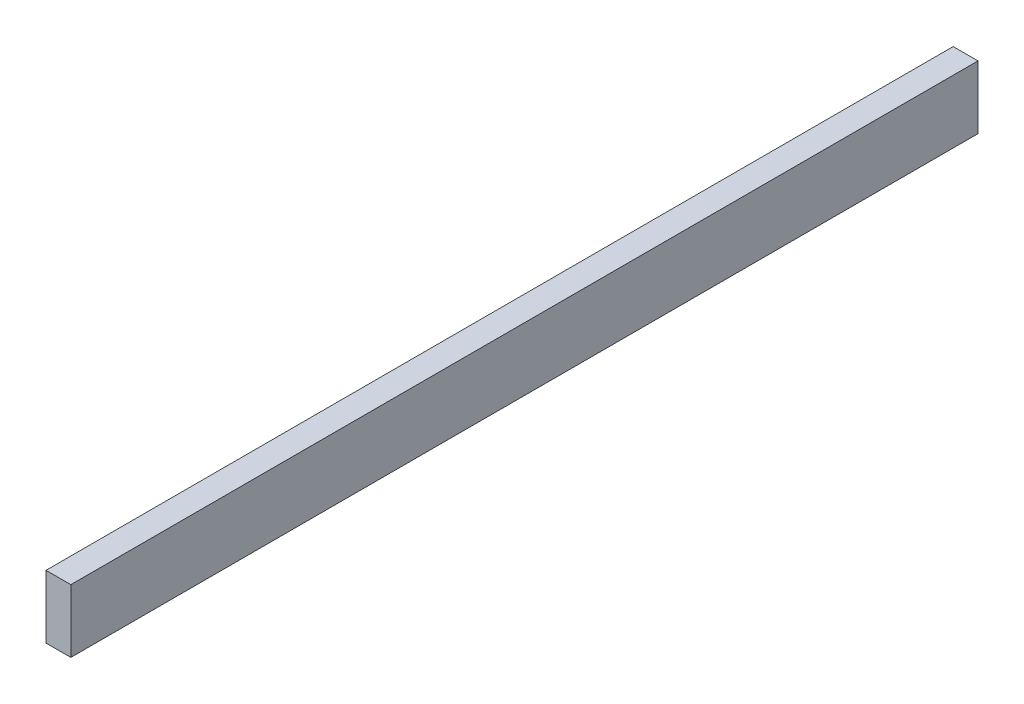
ISO-10303-21;
HEADER;
FILE_DESCRIPTION(('STEP AP214'),'2;1');
FILE_NAME('part.step','',(''),(''),'','','');
FILE_SCHEMA(('AUTOMOTIVE_DESIGN { 1 0 10303 214 1 1 1 1 }'));
ENDSEC;
DATA;
#1=APPLICATION_CONTEXT('core data for automotive mechanical design processes');
#2=APPLICATION_PROTOCOL_DEFINITION('international standard','automotive_design',2000,#1);
#3=PRODUCT_CONTEXT('',#1,'mechanical');
#4=PRODUCT('Part','Part','',(#3));
#5=PRODUCT_RELATED_PRODUCT_CATEGORY('part','',(#4));
#6=PRODUCT_DEFINITION_FORMATION('','',#4);
#7=PRODUCT_DEFINITION_CONTEXT('part definition',#1,'design');
#8=PRODUCT_DEFINITION('design','',#6,#7);
#9=PRODUCT_DEFINITION_SHAPE('','',#8);
#10=(LENGTH_UNIT() NAMED_UNIT(*) SI_UNIT(.MILLI.,.METRE.));
#11=(NAMED_UNIT(*) PLANE_ANGLE_UNIT() SI_UNIT($,.RADIAN.));
#12=(NAMED_UNIT(*) SI_UNIT($,.STERADIAN.) SOLID_ANGLE_UNIT());
#13=UNCERTAINTY_MEASURE_WITH_UNIT(LENGTH_MEASURE(1.E-05),#10,'distance_accuracy_value','');
#14=(GEOMETRIC_REPRESENTATION_CONTEXT(3) GLOBAL_UNCERTAINTY_ASSIGNED_CONTEXT((#13)) GLOBAL_UNIT_ASSIGNED_CONTEXT((#10,
#11,#12)) REPRESENTATION_CONTEXT('',''));
#15=CARTESIAN_POINT('',(0.,0.,0.));
#16=DIRECTION('',(0.,0.,1.));
#17=DIRECTION('',(1.,0.,0.));
#18=AXIS2_PLACEMENT_3D('',#15,#16,#17);
#19=CARTESIAN_POINT('',(-212.,22.86,-601.13571409881));
#20=DIRECTION('',(-1.,0.,0.));
#21=DIRECTION('',(0.,0.,1.));
#22=AXIS2_PLACEMENT_3D('',#19,#20,#21);
#23=PLANE('',#22);
#24=DIRECTION('',(0.,0.,1.));
#25=VECTOR('',#24,1.);
#26=CARTESIAN_POINT('',(-212.,22.86,-601.13571409881));
#27=LINE('',#26,#25);
#28=CARTESIAN_POINT('',(-212.,22.86,-657.999999999975));
#29=VERTEX_POINT('',#28);
#30=CARTESIAN_POINT('',(-212.,22.86,0.));
#31=VERTEX_POINT('',#30);
#32=EDGE_CURVE('E11',#29,#31,#27,.T.);
#33=ORIENTED_EDGE('',*,*,#32,.F.);
#34=DIRECTION('',(0.,-1.,0.));
#35=VECTOR('',#34,1.);
#36=CARTESIAN_POINT('',(-212.,-22.86,-657.999999999975));
#37=LINE('',#36,#35);
#38=CARTESIAN_POINT('',(-212.,-22.86,-657.999999999975));
#39=VERTEX_POINT('',#38);
#40=EDGE_CURVE('E94',#29,#39,#37,.T.);
#41=ORIENTED_EDGE('',*,*,#40,.T.);
#42=DIRECTION('',(0.,0.,1.));
#43=VECTOR('',#42,1.);
#44=CARTESIAN_POINT('',(-212.,-22.86,-601.13571409881));
#45=LINE('',#44,#43);
#46=CARTESIAN_POINT('',(-212.,-22.86,0.));
#47=VERTEX_POINT('',#46);
#48=EDGE_CURVE('E37',#39,#47,#45,.T.);
#49=ORIENTED_EDGE('',*,*,#48,.T.);
#50=DIRECTION('',(0.,-1.,0.));
#51=VECTOR('',#50,1.);
#52=CARTESIAN_POINT('',(-212.,22.86,0.));
#53=LINE('',#52,#51);
#54=EDGE_CURVE('E96',#31,#47,#53,.T.);
#55=ORIENTED_EDGE('',*,*,#54,.F.);
#56=EDGE_LOOP('',(#33,#41,#49,#55));
#57=FACE_BOUND('',#56,.T.);
#58=ADVANCED_FACE('F34',(#57),#23,.T.);
#59=CARTESIAN_POINT('',(-212.,22.86,-601.13571409881));
#60=DIRECTION('',(0.,1.,0.));
#61=DIRECTION('',(0.,0.,1.));
#62=AXIS2_PLACEMENT_3D('',#59,#60,#61);
#63=PLANE('',#62);
#64=DIRECTION('',(0.,0.,1.));
#65=VECTOR('',#64,1.);
#66=CARTESIAN_POINT('',(-194.,22.86,-601.13571409881));
#67=LINE('',#66,#65);
#68=CARTESIAN_POINT('',(-194.,22.86,-657.999999999975));
#69=VERTEX_POINT('',#68);
#70=CARTESIAN_POINT('',(-194.,22.86,0.));
#71=VERTEX_POINT('',#70);
#72=EDGE_CURVE('E42',#69,#71,#67,.T.);
#73=ORIENTED_EDGE('',*,*,#72,.F.);
#74=DIRECTION('',(-1.,0.,0.));
#75=VECTOR('',#74,1.);
#76=CARTESIAN_POINT('',(-212.,22.86,-657.999999999975));
#77=LINE('',#76,#75);
#78=EDGE_CURVE('E88',#69,#29,#77,.T.);
#79=ORIENTED_EDGE('',*,*,#78,.T.);
#80=ORIENTED_EDGE('',*,*,#32,.T.);
#81=DIRECTION('',(-1.,0.,0.));
#82=VECTOR('',#81,1.);
#83=CARTESIAN_POINT('',(-212.,22.86,0.));
#84=LINE('',#83,#82);
#85=EDGE_CURVE('E102',#71,#31,#84,.T.);
#86=ORIENTED_EDGE('',*,*,#85,.F.);
#87=EDGE_LOOP('',(#73,#79,#80,#86));
#88=FACE_BOUND('',#87,.T.);
#89=ADVANCED_FACE('F117',(#88),#63,.T.);
#90=CARTESIAN_POINT('',(-194.,22.86,-601.13571409881));
#91=DIRECTION('',(1.,0.,0.));
#92=DIRECTION('',(0.,0.,-1.));
#93=AXIS2_PLACEMENT_3D('',#90,#91,#92);
#94=PLANE('',#93);
#95=DIRECTION('',(0.,0.,1.));
#96=VECTOR('',#95,1.);
#97=CARTESIAN_POINT('',(-194.,-22.86,-601.13571409881));
#98=LINE('',#97,#96);
#99=CARTESIAN_POINT('',(-194.,-22.86,-657.999999999975));
#100=VERTEX_POINT('',#99);
#101=CARTESIAN_POINT('',(-194.,-22.86,0.));
#102=VERTEX_POINT('',#101);
#103=EDGE_CURVE('E72',#100,#102,#98,.T.);
#104=ORIENTED_EDGE('',*,*,#103,.F.);
#105=DIRECTION('',(0.,1.,0.));
#106=VECTOR('',#105,1.);
#107=CARTESIAN_POINT('',(-194.,-22.86,-657.999999999975));
#108=LINE('',#107,#106);
#109=EDGE_CURVE('E75',#100,#69,#108,.T.);
#110=ORIENTED_EDGE('',*,*,#109,.T.);
#111=ORIENTED_EDGE('',*,*,#72,.T.);
#112=DIRECTION('',(0.,1.,0.));
#113=VECTOR('',#112,1.);
#114=CARTESIAN_POINT('',(-194.,22.86,0.));
#115=LINE('',#114,#113);
#116=EDGE_CURVE('E76',#102,#71,#115,.T.);
#117=ORIENTED_EDGE('',*,*,#116,.F.);
#118=EDGE_LOOP('',(#104,#110,#111,#117));
#119=FACE_BOUND('',#118,.T.);
#120=ADVANCED_FACE('F74',(#119),#94,.T.);
#121=CARTESIAN_POINT('',(-212.,-22.86,-601.13571409881));
#122=DIRECTION('',(0.,-1.,0.));
#123=DIRECTION('',(1.,0.,0.));
#124=AXIS2_PLACEMENT_3D('',#121,#122,#123);
#125=PLANE('',#124);
#126=ORIENTED_EDGE('',*,*,#48,.F.);
#127=DIRECTION('',(1.,0.,0.));
#128=VECTOR('',#127,1.);
#129=CARTESIAN_POINT('',(-212.,-22.86,-657.999999999975));
#130=LINE('',#129,#128);
#131=EDGE_CURVE('E86',#39,#100,#130,.T.);
#132=ORIENTED_EDGE('',*,*,#131,.T.);
#133=ORIENTED_EDGE('',*,*,#103,.T.);
#134=DIRECTION('',(1.,0.,0.));
#135=VECTOR('',#134,1.);
#136=CARTESIAN_POINT('',(-212.,-22.86,0.));
#137=LINE('',#136,#135);
#138=EDGE_CURVE('E99',#47,#102,#137,.T.);
#139=ORIENTED_EDGE('',*,*,#138,.F.);
#140=EDGE_LOOP('',(#126,#132,#133,#139));
#141=FACE_BOUND('',#140,.T.);
#142=ADVANCED_FACE('F90',(#141),#125,.T.);
#143=CARTESIAN_POINT('',(0.,0.,0.));
#144=DIRECTION('',(0.,0.,1.));
#145=DIRECTION('',(1.,0.,0.));
#146=AXIS2_PLACEMENT_3D('',#143,#144,#145);
#147=PLANE('',#146);
#148=ORIENTED_EDGE('',*,*,#54,.T.);
#149=ORIENTED_EDGE('',*,*,#138,.T.);
#150=ORIENTED_EDGE('',*,*,#116,.T.);
#151=ORIENTED_EDGE('',*,*,#85,.T.);
#152=EDGE_LOOP('',(#148,#149,#150,#151));
#153=FACE_BOUND('',#152,.T.);
#154=ADVANCED_FACE('F107',(#153),#147,.T.);
#155=CARTESIAN_POINT('',(-12.7000000000002,-10.5,-657.999999999975));
#156=DIRECTION('',(0.,0.,1.));
#157=DIRECTION('',(0.,1.,0.));
#158=AXIS2_PLACEMENT_3D('',#155,#156,#157);
#159=PLANE('',#158);
#160=ORIENTED_EDGE('',*,*,#78,.F.);
#161=ORIENTED_EDGE('',*,*,#109,.F.);
#162=ORIENTED_EDGE('',*,*,#131,.F.);
#163=ORIENTED_EDGE('',*,*,#40,.F.);
#164=EDGE_LOOP('',(#160,#161,#162,#163));
#165=FACE_BOUND('',#164,.T.);
#166=ADVANCED_FACE('F84',(#165),#159,.F.);
#167=CLOSED_SHELL('',(#58,#89,#120,#142,#154,#166));
#168=MANIFOLD_SOLID_BREP('B2',#167);
#169=ADVANCED_BREP_SHAPE_REPRESENTATION('',(#18,#168),#14);
#170=SHAPE_DEFINITION_REPRESENTATION(#9,#169);
ENDSEC;
END-ISO-10303-21;
